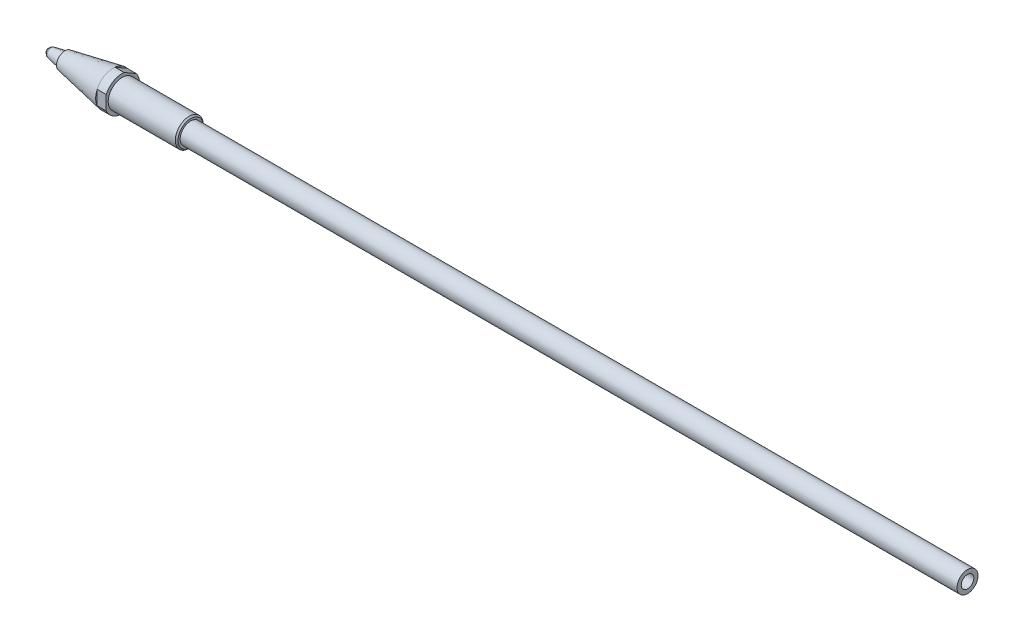
ISO-10303-21;
HEADER;
FILE_DESCRIPTION(('STEP AP214'),'2;1');
FILE_NAME('part.step','',(''),(''),'','','');
FILE_SCHEMA(('AUTOMOTIVE_DESIGN { 1 0 10303 214 1 1 1 1 }'));
ENDSEC;
DATA;
#1=APPLICATION_CONTEXT('core data for automotive mechanical design processes');
#2=APPLICATION_PROTOCOL_DEFINITION('international standard','automotive_design',2000,#1);
#3=PRODUCT_CONTEXT('',#1,'mechanical');
#4=PRODUCT('Part','Part','',(#3));
#5=PRODUCT_RELATED_PRODUCT_CATEGORY('part','',(#4));
#6=PRODUCT_DEFINITION_FORMATION('','',#4);
#7=PRODUCT_DEFINITION_CONTEXT('part definition',#1,'design');
#8=PRODUCT_DEFINITION('design','',#6,#7);
#9=PRODUCT_DEFINITION_SHAPE('','',#8);
#10=(LENGTH_UNIT() NAMED_UNIT(*) SI_UNIT(.MILLI.,.METRE.));
#11=(NAMED_UNIT(*) PLANE_ANGLE_UNIT() SI_UNIT($,.RADIAN.));
#12=(NAMED_UNIT(*) SI_UNIT($,.STERADIAN.) SOLID_ANGLE_UNIT());
#13=UNCERTAINTY_MEASURE_WITH_UNIT(LENGTH_MEASURE(1.E-05),#10,'distance_accuracy_value','');
#14=(GEOMETRIC_REPRESENTATION_CONTEXT(3) GLOBAL_UNCERTAINTY_ASSIGNED_CONTEXT((#13)) GLOBAL_UNIT_ASSIGNED_CONTEXT((#10,
#11,#12)) REPRESENTATION_CONTEXT('',''));
#15=CARTESIAN_POINT('',(0.,0.,0.));
#16=DIRECTION('',(0.,0.,1.));
#17=DIRECTION('',(1.,0.,0.));
#18=AXIS2_PLACEMENT_3D('',#15,#16,#17);
#19=CARTESIAN_POINT('',(60.5,0.,0.));
#20=DIRECTION('',(1.,0.,0.));
#21=DIRECTION('',(0.,0.,-1.));
#22=AXIS2_PLACEMENT_3D('',#19,#20,#21);
#23=PLANE('',#22);
#24=CARTESIAN_POINT('',(60.5,0.,0.));
#25=DIRECTION('',(-1.,0.,0.));
#26=DIRECTION('',(0.,-1.,0.));
#27=AXIS2_PLACEMENT_3D('',#24,#25,#26);
#28=CIRCLE('',#27,0.9);
#29=CARTESIAN_POINT('',(60.5,0.9,0.));
#30=VERTEX_POINT('',#29);
#31=EDGE_CURVE('P0_E27',#30,#30,#28,.T.);
#32=ORIENTED_EDGE('',*,*,#31,.T.);
#33=EDGE_LOOP('',(#32));
#34=FACE_BOUND('',#33,.T.);
#35=CARTESIAN_POINT('',(60.5,0.,0.));
#36=DIRECTION('',(1.,0.,0.));
#37=DIRECTION('',(0.,1.,0.));
#38=AXIS2_PLACEMENT_3D('',#35,#36,#37);
#39=CIRCLE('',#38,1.5);
#40=CARTESIAN_POINT('',(60.5,1.5,0.));
#41=VERTEX_POINT('',#40);
#42=EDGE_CURVE('P0_E11',#41,#41,#39,.T.);
#43=ORIENTED_EDGE('',*,*,#42,.T.);
#44=EDGE_LOOP('',(#43));
#45=FACE_BOUND('',#44,.T.);
#46=ADVANCED_FACE('P0_F17',(#34,#45),#23,.T.);
#47=CARTESIAN_POINT('',(0.,0.,0.));
#48=DIRECTION('',(-1.,0.,0.));
#49=DIRECTION('',(0.,1.,0.));
#50=AXIS2_PLACEMENT_3D('',#47,#48,#49);
#51=CYLINDRICAL_SURFACE('',#50,1.5);
#52=ORIENTED_EDGE('',*,*,#42,.F.);
#53=EDGE_LOOP('',(#52));
#54=FACE_BOUND('',#53,.T.);
#55=CARTESIAN_POINT('',(-60.5,0.,0.));
#56=DIRECTION('',(-1.,0.,0.));
#57=DIRECTION('',(0.,1.,0.));
#58=AXIS2_PLACEMENT_3D('',#55,#56,#57);
#59=CIRCLE('',#58,1.5);
#60=CARTESIAN_POINT('',(-60.5,1.5,0.));
#61=VERTEX_POINT('',#60);
#62=EDGE_CURVE('P0_E42',#61,#61,#59,.T.);
#63=ORIENTED_EDGE('',*,*,#62,.F.);
#64=EDGE_LOOP('',(#63));
#65=FACE_BOUND('',#64,.T.);
#66=ADVANCED_FACE('P0_F19',(#54,#65),#51,.T.);
#67=CARTESIAN_POINT('',(0.,0.,0.));
#68=DIRECTION('',(-1.,0.,0.));
#69=DIRECTION('',(0.,-1.,0.));
#70=AXIS2_PLACEMENT_3D('',#67,#68,#69);
#71=CYLINDRICAL_SURFACE('',#70,0.9);
#72=ORIENTED_EDGE('',*,*,#31,.F.);
#73=EDGE_LOOP('',(#72));
#74=FACE_BOUND('',#73,.T.);
#75=CARTESIAN_POINT('',(-60.5,0.,0.));
#76=DIRECTION('',(1.,0.,0.));
#77=DIRECTION('',(0.,-1.,0.));
#78=AXIS2_PLACEMENT_3D('',#75,#76,#77);
#79=CIRCLE('',#78,0.9);
#80=CARTESIAN_POINT('',(-60.5,0.9,0.));
#81=VERTEX_POINT('',#80);
#82=EDGE_CURVE('P0_E38',#81,#81,#79,.T.);
#83=ORIENTED_EDGE('',*,*,#82,.F.);
#84=EDGE_LOOP('',(#83));
#85=FACE_BOUND('',#84,.T.);
#86=ADVANCED_FACE('P0_F56',(#74,#85),#71,.F.);
#87=CARTESIAN_POINT('',(-60.5,0.,0.));
#88=DIRECTION('',(1.,0.,0.));
#89=DIRECTION('',(0.,0.,-1.));
#90=AXIS2_PLACEMENT_3D('',#87,#88,#89);
#91=PLANE('',#90);
#92=ORIENTED_EDGE('',*,*,#82,.T.);
#93=EDGE_LOOP('',(#92));
#94=FACE_BOUND('',#93,.T.);
#95=ORIENTED_EDGE('',*,*,#62,.T.);
#96=EDGE_LOOP('',(#95));
#97=FACE_BOUND('',#96,.T.);
#98=ADVANCED_FACE('P0_F43',(#94,#97),#91,.F.);
#99=CLOSED_SHELL('',(#46,#66,#86,#98));
#100=MANIFOLD_SOLID_BREP('P0_B1',#99);
#101=CARTESIAN_POINT('',(45.5,0.,0.));
#102=DIRECTION('',(-1.,0.,0.));
#103=DIRECTION('',(0.,0.,1.));
#104=AXIS2_PLACEMENT_3D('',#101,#102,#103);
#105=PLANE('',#104);
#106=CARTESIAN_POINT('',(45.5,0.,0.));
#107=DIRECTION('',(1.,0.,0.));
#108=DIRECTION('',(0.,0.,1.));
#109=AXIS2_PLACEMENT_3D('',#106,#107,#108);
#110=CIRCLE('',#109,0.9);
#111=CARTESIAN_POINT('',(45.5,0.,0.9));
#112=VERTEX_POINT('',#111);
#113=EDGE_CURVE('P1_E20',#112,#112,#110,.T.);
#114=ORIENTED_EDGE('',*,*,#113,.T.);
#115=EDGE_LOOP('',(#114));
#116=FACE_BOUND('',#115,.T.);
#117=ADVANCED_FACE('P1_F17',(#116),#105,.F.);
#118=CARTESIAN_POINT('',(-60.5,0.,0.));
#119=DIRECTION('',(-1.,0.,0.));
#120=DIRECTION('',(0.,0.,1.));
#121=AXIS2_PLACEMENT_3D('',#118,#119,#120);
#122=PLANE('',#121);
#123=CARTESIAN_POINT('',(-60.5,0.,0.));
#124=DIRECTION('',(-1.,0.,0.));
#125=DIRECTION('',(0.,0.,1.));
#126=AXIS2_PLACEMENT_3D('',#123,#124,#125);
#127=CIRCLE('',#126,0.9);
#128=CARTESIAN_POINT('',(-60.5,0.,0.9));
#129=VERTEX_POINT('',#128);
#130=EDGE_CURVE('P1_E11',#129,#129,#127,.T.);
#131=ORIENTED_EDGE('',*,*,#130,.T.);
#132=EDGE_LOOP('',(#131));
#133=FACE_BOUND('',#132,.T.);
#134=ADVANCED_FACE('P1_F45',(#133),#122,.T.);
#135=CARTESIAN_POINT('',(-60.5,0.,0.));
#136=DIRECTION('',(-1.,0.,0.));
#137=DIRECTION('',(0.,0.,1.));
#138=AXIS2_PLACEMENT_3D('',#135,#136,#137);
#139=CYLINDRICAL_SURFACE('',#138,0.9);
#140=ORIENTED_EDGE('',*,*,#130,.F.);
#141=EDGE_LOOP('',(#140));
#142=FACE_BOUND('',#141,.T.);
#143=ORIENTED_EDGE('',*,*,#113,.F.);
#144=EDGE_LOOP('',(#143));
#145=FACE_BOUND('',#144,.T.);
#146=ADVANCED_FACE('P1_F40',(#142,#145),#139,.T.);
#147=CLOSED_SHELL('',(#117,#134,#146));
#148=MANIFOLD_SOLID_BREP('P1_B1',#147);
#149=CARTESIAN_POINT('',(-60.5,0.,-2.));
#150=DIRECTION('',(1.,0.,0.));
#151=DIRECTION('',(0.,0.,-1.));
#152=AXIS2_PLACEMENT_3D('',#149,#150,#151);
#153=PLANE('',#152);
#154=CARTESIAN_POINT('',(-60.5,0.,0.));
#155=DIRECTION('',(1.,0.,0.));
#156=DIRECTION('',(0.,0.,-1.));
#157=AXIS2_PLACEMENT_3D('',#154,#155,#156);
#158=CIRCLE('',#157,2.);
#159=CARTESIAN_POINT('',(-60.5,0.,-2.));
#160=VERTEX_POINT('',#159);
#161=EDGE_CURVE('P2_E82',#160,#160,#158,.T.);
#162=ORIENTED_EDGE('',*,*,#161,.F.);
#163=EDGE_LOOP('',(#162));
#164=FACE_BOUND('',#163,.T.);
#165=DIRECTION('',(0.,0.5,0.866025403784439));
#166=VECTOR('',#165,1.);
#167=CARTESIAN_POINT('',(-60.5,1.28998528875859,-2.3324605483448));
#168=LINE('',#167,#166);
#169=CARTESIAN_POINT('',(-60.5,1.46852197063688,-2.02322594431685));
#170=VERTEX_POINT('',#169);
#171=CARTESIAN_POINT('',(-60.5,2.48642605069259,-0.2601643604287));
#172=VERTEX_POINT('',#171);
#173=EDGE_CURVE('P2_E112',#170,#172,#168,.T.);
#174=ORIENTED_EDGE('',*,*,#173,.T.);
#175=CARTESIAN_POINT('',(-60.5,0.,0.));
#176=DIRECTION('',(1.,0.,0.));
#177=DIRECTION('',(0.,0.,-1.));
#178=AXIS2_PLACEMENT_3D('',#175,#176,#177);
#179=CIRCLE('',#178,2.5);
#180=CARTESIAN_POINT('',(-60.5,1.01790408005571,2.28339030474555));
#181=VERTEX_POINT('',#180);
#182=EDGE_CURVE('P2_E78',#172,#181,#179,.T.);
#183=ORIENTED_EDGE('',*,*,#182,.T.);
#184=DIRECTION('',(0.,-1.,0.));
#185=VECTOR('',#184,1.);
#186=CARTESIAN_POINT('',(-60.5,0.508952040027854,2.28339030474555));
#187=LINE('',#186,#185);
#188=CARTESIAN_POINT('',(-60.5,-1.01790408005571,2.28339030474555));
#189=VERTEX_POINT('',#188);
#190=EDGE_CURVE('P2_E70',#181,#189,#187,.T.);
#191=ORIENTED_EDGE('',*,*,#190,.T.);
#192=CARTESIAN_POINT('',(-60.5,0.,0.));
#193=DIRECTION('',(1.,0.,0.));
#194=DIRECTION('',(0.,0.,-1.));
#195=AXIS2_PLACEMENT_3D('',#192,#193,#194);
#196=CIRCLE('',#195,2.5);
#197=CARTESIAN_POINT('',(-60.5,-2.48642605069259,-0.260164360428699));
#198=VERTEX_POINT('',#197);
#199=EDGE_CURVE('P2_E75',#189,#198,#196,.T.);
#200=ORIENTED_EDGE('',*,*,#199,.T.);
#201=DIRECTION('',(0.,0.5,-0.866025403784439));
#202=VECTOR('',#201,1.);
#203=CARTESIAN_POINT('',(-60.5,-1.79893732878644,-1.45092975640073));
#204=LINE('',#203,#202);
#205=CARTESIAN_POINT('',(-60.5,-1.46852197063688,-2.02322594431685));
#206=VERTEX_POINT('',#205);
#207=EDGE_CURVE('P2_E179',#198,#206,#204,.T.);
#208=ORIENTED_EDGE('',*,*,#207,.T.);
#209=CARTESIAN_POINT('',(-60.5,0.,0.));
#210=DIRECTION('',(1.,0.,0.));
#211=DIRECTION('',(0.,0.,-1.));
#212=AXIS2_PLACEMENT_3D('',#209,#210,#211);
#213=CIRCLE('',#212,2.5);
#214=EDGE_CURVE('P2_E64',#206,#170,#213,.T.);
#215=ORIENTED_EDGE('',*,*,#214,.T.);
#216=EDGE_LOOP('',(#174,#183,#191,#200,#208,#215));
#217=FACE_BOUND('',#216,.T.);
#218=ADVANCED_FACE('P2_F17',(#164,#217),#153,.T.);
#219=CARTESIAN_POINT('',(-65.25,0.,0.));
#220=DIRECTION('',(1.,0.,0.));
#221=DIRECTION('',(0.,0.,-1.));
#222=AXIS2_PLACEMENT_3D('',#219,#220,#221);
#223=CONICAL_SURFACE('',#222,1.85,0.186222840411141);
#224=CARTESIAN_POINT('',(-61.8,0.,0.));
#225=DIRECTION('',(1.,0.,0.));
#226=DIRECTION('',(0.,0.,-1.));
#227=AXIS2_PLACEMENT_3D('',#224,#225,#226);
#228=CIRCLE('',#227,2.5);
#229=CARTESIAN_POINT('',(-61.8,-1.01790408005571,2.28339030474555));
#230=VERTEX_POINT('',#229);
#231=CARTESIAN_POINT('',(-61.8,-2.48642605069259,-0.260164360428699));
#232=VERTEX_POINT('',#231);
#233=EDGE_CURVE('P2_E91',#230,#232,#228,.T.);
#234=ORIENTED_EDGE('',*,*,#233,.F.);
#235=CARTESIAN_POINT('',(-61.8,0.,0.));
#236=DIRECTION('',(1.,0.,0.));
#237=DIRECTION('',(0.,0.,-1.));
#238=AXIS2_PLACEMENT_3D('',#235,#236,#237);
#239=CIRCLE('',#238,2.5);
#240=CARTESIAN_POINT('',(-61.8,1.01790408005571,2.28339030474555));
#241=VERTEX_POINT('',#240);
#242=EDGE_CURVE('P2_E118',#241,#230,#239,.T.);
#243=ORIENTED_EDGE('',*,*,#242,.F.);
#244=CARTESIAN_POINT('',(-61.8,0.,0.));
#245=DIRECTION('',(1.,0.,0.));
#246=DIRECTION('',(0.,0.,-1.));
#247=AXIS2_PLACEMENT_3D('',#244,#245,#246);
#248=CIRCLE('',#247,2.5);
#249=CARTESIAN_POINT('',(-61.8,2.48642605069259,-0.2601643604287));
#250=VERTEX_POINT('',#249);
#251=EDGE_CURVE('P2_E106',#250,#241,#248,.T.);
#252=ORIENTED_EDGE('',*,*,#251,.F.);
#253=CARTESIAN_POINT('',(-61.8,0.,0.));
#254=DIRECTION('',(1.,0.,0.));
#255=DIRECTION('',(0.,0.,-1.));
#256=AXIS2_PLACEMENT_3D('',#253,#254,#255);
#257=CIRCLE('',#256,2.5);
#258=CARTESIAN_POINT('',(-61.8,1.46852197063688,-2.02322594431685));
#259=VERTEX_POINT('',#258);
#260=EDGE_CURVE('P2_E113',#259,#250,#257,.T.);
#261=ORIENTED_EDGE('',*,*,#260,.F.);
#262=CARTESIAN_POINT('',(-61.8,0.,0.));
#263=DIRECTION('',(1.,0.,0.));
#264=DIRECTION('',(0.,0.,-1.));
#265=AXIS2_PLACEMENT_3D('',#262,#263,#264);
#266=CIRCLE('',#265,2.5);
#267=CARTESIAN_POINT('',(-61.8,-1.46852197063688,-2.02322594431685));
#268=VERTEX_POINT('',#267);
#269=EDGE_CURVE('P2_E124',#268,#259,#266,.T.);
#270=ORIENTED_EDGE('',*,*,#269,.F.);
#271=CARTESIAN_POINT('',(-61.8,0.,0.));
#272=DIRECTION('',(1.,0.,0.));
#273=DIRECTION('',(0.,0.,-1.));
#274=AXIS2_PLACEMENT_3D('',#271,#272,#273);
#275=CIRCLE('',#274,2.5);
#276=EDGE_CURVE('P2_E140',#232,#268,#275,.T.);
#277=ORIENTED_EDGE('',*,*,#276,.F.);
#278=EDGE_LOOP('',(#234,#243,#252,#261,#270,#277));
#279=FACE_BOUND('',#278,.T.);
#280=CARTESIAN_POINT('',(-68.7,0.,0.));
#281=DIRECTION('',(1.,0.,0.));
#282=DIRECTION('',(0.,0.,-1.));
#283=AXIS2_PLACEMENT_3D('',#280,#281,#282);
#284=CIRCLE('',#283,1.2);
#285=CARTESIAN_POINT('',(-68.7,0.,-1.2));
#286=VERTEX_POINT('',#285);
#287=EDGE_CURVE('P2_E11',#286,#286,#284,.T.);
#288=ORIENTED_EDGE('',*,*,#287,.T.);
#289=EDGE_LOOP('',(#288));
#290=FACE_BOUND('',#289,.T.);
#291=ADVANCED_FACE('P2_F207',(#279,#290),#223,.T.);
#292=CARTESIAN_POINT('',(-68.7,0.,-1.2));
#293=DIRECTION('',(-1.,0.,0.));
#294=DIRECTION('',(0.,0.,1.));
#295=AXIS2_PLACEMENT_3D('',#292,#293,#294);
#296=PLANE('',#295);
#297=ORIENTED_EDGE('',*,*,#287,.F.);
#298=EDGE_LOOP('',(#297));
#299=FACE_BOUND('',#298,.T.);
#300=CARTESIAN_POINT('',(-68.7,0.,0.));
#301=DIRECTION('',(1.,0.,0.));
#302=DIRECTION('',(0.,0.,-1.));
#303=AXIS2_PLACEMENT_3D('',#300,#301,#302);
#304=CIRCLE('',#303,1.);
#305=CARTESIAN_POINT('',(-68.7,0.,-1.));
#306=VERTEX_POINT('',#305);
#307=EDGE_CURVE('P2_E28',#306,#306,#304,.T.);
#308=ORIENTED_EDGE('',*,*,#307,.T.);
#309=EDGE_LOOP('',(#308));
#310=FACE_BOUND('',#309,.T.);
#311=ADVANCED_FACE('P2_F232',(#299,#310),#296,.T.);
#312=CARTESIAN_POINT('',(-67.786064992748,0.,0.));
#313=DIRECTION('',(-1.,0.,0.));
#314=DIRECTION('',(0.,0.,-1.));
#315=AXIS2_PLACEMENT_3D('',#312,#313,#314);
#316=CYLINDRICAL_SURFACE('',#315,1.);
#317=ORIENTED_EDGE('',*,*,#307,.F.);
#318=EDGE_LOOP('',(#317));
#319=FACE_BOUND('',#318,.T.);
#320=CARTESIAN_POINT('',(-66.8721299854961,0.,0.));
#321=DIRECTION('',(1.,0.,0.));
#322=DIRECTION('',(0.,0.,-1.));
#323=AXIS2_PLACEMENT_3D('',#320,#321,#322);
#324=CIRCLE('',#323,1.);
#325=CARTESIAN_POINT('',(-66.8721299854961,0.,-1.));
#326=VERTEX_POINT('',#325);
#327=EDGE_CURVE('P2_E145',#326,#326,#324,.T.);
#328=ORIENTED_EDGE('',*,*,#327,.T.);
#329=EDGE_LOOP('',(#328));
#330=FACE_BOUND('',#329,.T.);
#331=ADVANCED_FACE('P2_F261',(#319,#330),#316,.F.);
#332=CARTESIAN_POINT('',(-64.336064992748,0.,0.));
#333=DIRECTION('',(1.,0.,0.));
#334=DIRECTION('',(0.,0.,-1.));
#335=AXIS2_PLACEMENT_3D('',#332,#333,#334);
#336=CONICAL_SURFACE('',#335,1.47780934645977,0.186222840411142);
#337=ORIENTED_EDGE('',*,*,#327,.F.);
#338=EDGE_LOOP('',(#337));
#339=FACE_BOUND('',#338,.T.);
#340=CARTESIAN_POINT('',(-61.8,0.,0.));
#341=DIRECTION('',(1.,0.,0.));
#342=DIRECTION('',(0.,0.,-1.));
#343=AXIS2_PLACEMENT_3D('',#340,#341,#342);
#344=CIRCLE('',#343,1.95561869291954);
#345=CARTESIAN_POINT('',(-61.8,0.,-1.95561869291954));
#346=VERTEX_POINT('',#345);
#347=EDGE_CURVE('P2_E149',#346,#346,#344,.T.);
#348=ORIENTED_EDGE('',*,*,#347,.T.);
#349=EDGE_LOOP('',(#348));
#350=FACE_BOUND('',#349,.T.);
#351=ADVANCED_FACE('P2_F242',(#339,#350),#336,.F.);
#352=CARTESIAN_POINT('',(-61.8,0.,-1.95561869291954));
#353=DIRECTION('',(-1.,0.,0.));
#354=DIRECTION('',(0.,0.,1.));
#355=AXIS2_PLACEMENT_3D('',#352,#353,#354);
#356=PLANE('',#355);
#357=ORIENTED_EDGE('',*,*,#347,.F.);
#358=EDGE_LOOP('',(#357));
#359=FACE_BOUND('',#358,.T.);
#360=CARTESIAN_POINT('',(-61.8,0.,0.));
#361=DIRECTION('',(1.,0.,0.));
#362=DIRECTION('',(0.,0.,-1.));
#363=AXIS2_PLACEMENT_3D('',#360,#361,#362);
#364=CIRCLE('',#363,1.5);
#365=CARTESIAN_POINT('',(-61.8,0.,-1.5));
#366=VERTEX_POINT('',#365);
#367=EDGE_CURVE('P2_E152',#366,#366,#364,.T.);
#368=ORIENTED_EDGE('',*,*,#367,.T.);
#369=EDGE_LOOP('',(#368));
#370=FACE_BOUND('',#369,.T.);
#371=ADVANCED_FACE('P2_F239',(#359,#370),#356,.T.);
#372=CARTESIAN_POINT('',(-56.25,0.,0.));
#373=DIRECTION('',(-1.,0.,0.));
#374=DIRECTION('',(0.,0.,-1.));
#375=AXIS2_PLACEMENT_3D('',#372,#373,#374);
#376=CYLINDRICAL_SURFACE('',#375,1.5);
#377=ORIENTED_EDGE('',*,*,#367,.F.);
#378=EDGE_LOOP('',(#377));
#379=FACE_BOUND('',#378,.T.);
#380=CARTESIAN_POINT('',(-50.7,0.,0.));
#381=DIRECTION('',(1.,0.,0.));
#382=DIRECTION('',(0.,0.,-1.));
#383=AXIS2_PLACEMENT_3D('',#380,#381,#382);
#384=CIRCLE('',#383,1.5);
#385=CARTESIAN_POINT('',(-50.7,0.,-1.5));
#386=VERTEX_POINT('',#385);
#387=EDGE_CURVE('P2_E155',#386,#386,#384,.T.);
#388=ORIENTED_EDGE('',*,*,#387,.T.);
#389=EDGE_LOOP('',(#388));
#390=FACE_BOUND('',#389,.T.);
#391=ADVANCED_FACE('P2_F241',(#379,#390),#376,.F.);
#392=CARTESIAN_POINT('',(-50.7,0.,-1.5));
#393=DIRECTION('',(1.,0.,0.));
#394=DIRECTION('',(0.,0.,-1.));
#395=AXIS2_PLACEMENT_3D('',#392,#393,#394);
#396=PLANE('',#395);
#397=ORIENTED_EDGE('',*,*,#387,.F.);
#398=EDGE_LOOP('',(#397));
#399=FACE_BOUND('',#398,.T.);
#400=CARTESIAN_POINT('',(-50.7,0.,0.));
#401=DIRECTION('',(1.,0.,0.));
#402=DIRECTION('',(0.,0.,-1.));
#403=AXIS2_PLACEMENT_3D('',#400,#401,#402);
#404=CIRCLE('',#403,1.8);
#405=CARTESIAN_POINT('',(-50.7,0.,-1.8));
#406=VERTEX_POINT('',#405);
#407=EDGE_CURVE('P2_E156',#406,#406,#404,.T.);
#408=ORIENTED_EDGE('',*,*,#407,.T.);
#409=EDGE_LOOP('',(#408));
#410=FACE_BOUND('',#409,.T.);
#411=ADVANCED_FACE('P2_F237',(#399,#410),#396,.T.);
#412=CARTESIAN_POINT('',(-50.8,0.,0.));
#413=DIRECTION('',(-1.,0.,0.));
#414=DIRECTION('',(0.,0.,-1.));
#415=AXIS2_PLACEMENT_3D('',#412,#413,#414);
#416=CONICAL_SURFACE('',#415,1.9,0.785398163397459);
#417=ORIENTED_EDGE('',*,*,#407,.F.);
#418=EDGE_LOOP('',(#417));
#419=FACE_BOUND('',#418,.T.);
#420=CARTESIAN_POINT('',(-50.9,0.,0.));
#421=DIRECTION('',(1.,0.,0.));
#422=DIRECTION('',(0.,0.,-1.));
#423=AXIS2_PLACEMENT_3D('',#420,#421,#422);
#424=CIRCLE('',#423,2.);
#425=CARTESIAN_POINT('',(-50.9,0.,-2.));
#426=VERTEX_POINT('',#425);
#427=EDGE_CURVE('P2_E116',#426,#426,#424,.T.);
#428=ORIENTED_EDGE('',*,*,#427,.T.);
#429=EDGE_LOOP('',(#428));
#430=FACE_BOUND('',#429,.T.);
#431=ADVANCED_FACE('P2_F255',(#419,#430),#416,.T.);
#432=CARTESIAN_POINT('',(-55.7,0.,0.));
#433=DIRECTION('',(-1.,0.,0.));
#434=DIRECTION('',(0.,0.,-1.));
#435=AXIS2_PLACEMENT_3D('',#432,#433,#434);
#436=CYLINDRICAL_SURFACE('',#435,2.);
#437=ORIENTED_EDGE('',*,*,#427,.F.);
#438=EDGE_LOOP('',(#437));
#439=FACE_BOUND('',#438,.T.);
#440=ORIENTED_EDGE('',*,*,#161,.T.);
#441=EDGE_LOOP('',(#440));
#442=FACE_BOUND('',#441,.T.);
#443=ADVANCED_FACE('P2_F250',(#439,#442),#436,.T.);
#444=CARTESIAN_POINT('',(-60.5,1.01790408005571,2.28339030474555));
#445=DIRECTION('',(0.,0.,-1.));
#446=DIRECTION('',(0.,-1.,0.));
#447=AXIS2_PLACEMENT_3D('',#444,#445,#446);
#448=PLANE('',#447);
#449=ORIENTED_EDGE('',*,*,#190,.F.);
#450=DIRECTION('',(1.,0.,0.));
#451=VECTOR('',#450,1.);
#452=CARTESIAN_POINT('',(-61.15,1.01790408005571,2.28339030474555));
#453=LINE('',#452,#451);
#454=EDGE_CURVE('P2_E21',#241,#181,#453,.T.);
#455=ORIENTED_EDGE('',*,*,#454,.F.);
#456=DIRECTION('',(0.,-1.,0.));
#457=VECTOR('',#456,1.);
#458=CARTESIAN_POINT('',(-61.8,-1.01790408005571,2.28339030474555));
#459=LINE('',#458,#457);
#460=EDGE_CURVE('P2_E83',#241,#230,#459,.T.);
#461=ORIENTED_EDGE('',*,*,#460,.T.);
#462=DIRECTION('',(-1.,0.,0.));
#463=VECTOR('',#462,1.);
#464=CARTESIAN_POINT('',(-61.15,-1.01790408005571,2.28339030474555));
#465=LINE('',#464,#463);
#466=EDGE_CURVE('P2_E86',#189,#230,#465,.T.);
#467=ORIENTED_EDGE('',*,*,#466,.F.);
#468=EDGE_LOOP('',(#449,#455,#461,#467));
#469=FACE_BOUND('',#468,.T.);
#470=ADVANCED_FACE('P2_F87',(#469),#448,.F.);
#471=CARTESIAN_POINT('',(-61.8,0.,2.47322424151381));
#472=DIRECTION('',(-1.,0.,0.));
#473=DIRECTION('',(0.,0.,1.));
#474=AXIS2_PLACEMENT_3D('',#471,#472,#473);
#475=PLANE('',#474);
#476=ORIENTED_EDGE('',*,*,#242,.T.);
#477=ORIENTED_EDGE('',*,*,#460,.F.);
#478=EDGE_LOOP('',(#476,#477));
#479=FACE_BOUND('',#478,.T.);
#480=ADVANCED_FACE('P2_F249',(#479),#475,.F.);
#481=CARTESIAN_POINT('',(-61.15,0.,0.));
#482=DIRECTION('',(-1.,0.,0.));
#483=DIRECTION('',(0.,0.,-1.));
#484=AXIS2_PLACEMENT_3D('',#481,#482,#483);
#485=CYLINDRICAL_SURFACE('',#484,2.5);
#486=DIRECTION('',(-1.,0.,0.));
#487=VECTOR('',#486,1.);
#488=CARTESIAN_POINT('',(-61.15,2.48642605069259,-0.2601643604287));
#489=LINE('',#488,#487);
#490=EDGE_CURVE('P2_E144',#172,#250,#489,.T.);
#491=ORIENTED_EDGE('',*,*,#490,.T.);
#492=ORIENTED_EDGE('',*,*,#251,.T.);
#493=ORIENTED_EDGE('',*,*,#454,.T.);
#494=ORIENTED_EDGE('',*,*,#182,.F.);
#495=EDGE_LOOP('',(#491,#492,#493,#494));
#496=FACE_BOUND('',#495,.T.);
#497=ADVANCED_FACE('P2_F253',(#496),#485,.T.);
#498=CARTESIAN_POINT('',(-61.15,0.,0.));
#499=DIRECTION('',(-1.,0.,0.));
#500=DIRECTION('',(0.,0.,-1.));
#501=AXIS2_PLACEMENT_3D('',#498,#499,#500);
#502=CYLINDRICAL_SURFACE('',#501,2.5);
#503=DIRECTION('',(1.,0.,0.));
#504=VECTOR('',#503,1.);
#505=CARTESIAN_POINT('',(-61.15,1.46852197063688,-2.02322594431685));
#506=LINE('',#505,#504);
#507=EDGE_CURVE('P2_E177',#259,#170,#506,.T.);
#508=ORIENTED_EDGE('',*,*,#507,.T.);
#509=ORIENTED_EDGE('',*,*,#214,.F.);
#510=DIRECTION('',(-1.,0.,0.));
#511=VECTOR('',#510,1.);
#512=CARTESIAN_POINT('',(-61.15,-1.46852197063688,-2.02322594431685));
#513=LINE('',#512,#511);
#514=EDGE_CURVE('P2_E98',#206,#268,#513,.T.);
#515=ORIENTED_EDGE('',*,*,#514,.T.);
#516=ORIENTED_EDGE('',*,*,#269,.T.);
#517=EDGE_LOOP('',(#508,#509,#515,#516));
#518=FACE_BOUND('',#517,.T.);
#519=ADVANCED_FACE('P2_F19',(#518),#502,.T.);
#520=CARTESIAN_POINT('',(-61.15,0.,0.));
#521=DIRECTION('',(-1.,0.,0.));
#522=DIRECTION('',(0.,0.,-1.));
#523=AXIS2_PLACEMENT_3D('',#520,#521,#522);
#524=CYLINDRICAL_SURFACE('',#523,2.5);
#525=DIRECTION('',(1.,0.,0.));
#526=VECTOR('',#525,1.);
#527=CARTESIAN_POINT('',(-61.15,-2.48642605069259,-0.260164360428699));
#528=LINE('',#527,#526);
#529=EDGE_CURVE('P2_E95',#232,#198,#528,.T.);
#530=ORIENTED_EDGE('',*,*,#529,.T.);
#531=ORIENTED_EDGE('',*,*,#199,.F.);
#532=ORIENTED_EDGE('',*,*,#466,.T.);
#533=ORIENTED_EDGE('',*,*,#233,.T.);
#534=EDGE_LOOP('',(#530,#531,#532,#533));
#535=FACE_BOUND('',#534,.T.);
#536=ADVANCED_FACE('P2_F93',(#535),#524,.T.);
#537=CARTESIAN_POINT('',(-60.5,-2.48642605069259,-0.260164360428699));
#538=DIRECTION('',(0.,0.866025403784439,0.5));
#539=DIRECTION('',(0.,0.5,-0.866025403784439));
#540=AXIS2_PLACEMENT_3D('',#537,#538,#539);
#541=PLANE('',#540);
#542=ORIENTED_EDGE('',*,*,#207,.F.);
#543=ORIENTED_EDGE('',*,*,#529,.F.);
#544=DIRECTION('',(0.,0.5,-0.866025403784439));
#545=VECTOR('',#544,1.);
#546=CARTESIAN_POINT('',(-61.8,-1.46852197063688,-2.02322594431685));
#547=LINE('',#546,#545);
#548=EDGE_CURVE('P2_E143',#232,#268,#547,.T.);
#549=ORIENTED_EDGE('',*,*,#548,.T.);
#550=ORIENTED_EDGE('',*,*,#514,.F.);
#551=EDGE_LOOP('',(#542,#543,#549,#550));
#552=FACE_BOUND('',#551,.T.);
#553=ADVANCED_FACE('P2_F212',(#552),#541,.F.);
#554=CARTESIAN_POINT('',(-61.8,-2.14187502240646,-1.2366121207569));
#555=DIRECTION('',(-1.,0.,0.));
#556=DIRECTION('',(0.,-0.866025403784439,-0.5));
#557=AXIS2_PLACEMENT_3D('',#554,#555,#556);
#558=PLANE('',#557);
#559=ORIENTED_EDGE('',*,*,#276,.T.);
#560=ORIENTED_EDGE('',*,*,#548,.F.);
#561=EDGE_LOOP('',(#559,#560));
#562=FACE_BOUND('',#561,.T.);
#563=ADVANCED_FACE('P2_F214',(#562),#558,.F.);
#564=CARTESIAN_POINT('',(-60.5,1.46852197063688,-2.02322594431685));
#565=DIRECTION('',(0.,-0.866025403784438,0.5));
#566=DIRECTION('',(0.,0.5,0.866025403784438));
#567=AXIS2_PLACEMENT_3D('',#564,#565,#566);
#568=PLANE('',#567);
#569=ORIENTED_EDGE('',*,*,#173,.F.);
#570=ORIENTED_EDGE('',*,*,#507,.F.);
#571=DIRECTION('',(0.,0.5,0.866025403784439));
#572=VECTOR('',#571,1.);
#573=CARTESIAN_POINT('',(-61.8,2.48642605069259,-0.2601643604287));
#574=LINE('',#573,#572);
#575=EDGE_CURVE('P2_E109',#259,#250,#574,.T.);
#576=ORIENTED_EDGE('',*,*,#575,.T.);
#577=ORIENTED_EDGE('',*,*,#490,.F.);
#578=EDGE_LOOP('',(#569,#570,#576,#577));
#579=FACE_BOUND('',#578,.T.);
#580=ADVANCED_FACE('P2_F187',(#579),#568,.F.);
#581=CARTESIAN_POINT('',(-61.8,2.14187502240645,-1.2366121207569));
#582=DIRECTION('',(-1.,0.,0.));
#583=DIRECTION('',(0.,0.866025403784438,-0.5));
#584=AXIS2_PLACEMENT_3D('',#581,#582,#583);
#585=PLANE('',#584);
#586=ORIENTED_EDGE('',*,*,#260,.T.);
#587=ORIENTED_EDGE('',*,*,#575,.F.);
#588=EDGE_LOOP('',(#586,#587));
#589=FACE_BOUND('',#588,.T.);
#590=ADVANCED_FACE('P2_F222',(#589),#585,.F.);
#591=CLOSED_SHELL('',(#218,#291,#311,#331,#351,#371,#391,#411,#431,#443,#470,#480,#497,#519,
#536,#553,#563,#580,#590));
#592=MANIFOLD_SOLID_BREP('P2_B1',#591);
#593=CARTESIAN_POINT('',(-69.45,0.,0.));
#594=DIRECTION('',(1.,0.,0.));
#595=DIRECTION('',(0.,0.,-1.));
#596=AXIS2_PLACEMENT_3D('',#593,#594,#595);
#597=CONICAL_SURFACE('',#596,0.436887853066543,0.214148108443051);
#598=CARTESIAN_POINT('',(-70.2,0.,0.));
#599=DIRECTION('',(1.,0.,0.));
#600=DIRECTION('',(0.,0.,-1.));
#601=AXIS2_PLACEMENT_3D('',#598,#599,#600);
#602=CIRCLE('',#601,0.273775706133088);
#603=CARTESIAN_POINT('',(-70.2,0.,-0.273775706133088));
#604=VERTEX_POINT('',#603);
#605=EDGE_CURVE('P3_E57',#604,#604,#602,.T.);
#606=ORIENTED_EDGE('',*,*,#605,.F.);
#607=EDGE_LOOP('',(#606));
#608=FACE_BOUND('',#607,.T.);
#609=CARTESIAN_POINT('',(-68.7,0.,0.));
#610=DIRECTION('',(1.,0.,0.));
#611=DIRECTION('',(0.,0.,-1.));
#612=AXIS2_PLACEMENT_3D('',#609,#610,#611);
#613=CIRCLE('',#612,0.6);
#614=CARTESIAN_POINT('',(-68.7,0.,-0.6));
#615=VERTEX_POINT('',#614);
#616=EDGE_CURVE('P3_E11',#615,#615,#613,.T.);
#617=ORIENTED_EDGE('',*,*,#616,.T.);
#618=EDGE_LOOP('',(#617));
#619=FACE_BOUND('',#618,.T.);
#620=ADVANCED_FACE('P3_F17',(#608,#619),#597,.F.);
#621=CARTESIAN_POINT('',(-67.786064992748,0.,0.));
#622=DIRECTION('',(-1.,0.,0.));
#623=DIRECTION('',(0.,0.,-1.));
#624=AXIS2_PLACEMENT_3D('',#621,#622,#623);
#625=CYLINDRICAL_SURFACE('',#624,0.6);
#626=ORIENTED_EDGE('',*,*,#616,.F.);
#627=EDGE_LOOP('',(#626));
#628=FACE_BOUND('',#627,.T.);
#629=CARTESIAN_POINT('',(-66.8721299854961,0.,0.));
#630=DIRECTION('',(1.,0.,0.));
#631=DIRECTION('',(0.,0.,-1.));
#632=AXIS2_PLACEMENT_3D('',#629,#630,#631);
#633=CIRCLE('',#632,0.6);
#634=CARTESIAN_POINT('',(-66.8721299854961,0.,-0.6));
#635=VERTEX_POINT('',#634);
#636=EDGE_CURVE('P3_E28',#635,#635,#633,.T.);
#637=ORIENTED_EDGE('',*,*,#636,.T.);
#638=EDGE_LOOP('',(#637));
#639=FACE_BOUND('',#638,.T.);
#640=ADVANCED_FACE('P3_F91',(#628,#639),#625,.F.);
#641=CARTESIAN_POINT('',(-66.8721299854961,0.,-0.6));
#642=DIRECTION('',(1.,0.,0.));
#643=DIRECTION('',(0.,0.,-1.));
#644=AXIS2_PLACEMENT_3D('',#641,#642,#643);
#645=PLANE('',#644);
#646=ORIENTED_EDGE('',*,*,#636,.F.);
#647=EDGE_LOOP('',(#646));
#648=FACE_BOUND('',#647,.T.);
#649=CARTESIAN_POINT('',(-66.8721299854961,0.,0.));
#650=DIRECTION('',(1.,0.,0.));
#651=DIRECTION('',(0.,0.,-1.));
#652=AXIS2_PLACEMENT_3D('',#649,#650,#651);
#653=CIRCLE('',#652,1.);
#654=CARTESIAN_POINT('',(-66.8721299854961,0.,-1.));
#655=VERTEX_POINT('',#654);
#656=EDGE_CURVE('P3_E59',#655,#655,#653,.T.);
#657=ORIENTED_EDGE('',*,*,#656,.T.);
#658=EDGE_LOOP('',(#657));
#659=FACE_BOUND('',#658,.T.);
#660=ADVANCED_FACE('P3_F96',(#648,#659),#645,.T.);
#661=CARTESIAN_POINT('',(-67.786064992748,0.,0.));
#662=DIRECTION('',(-1.,0.,0.));
#663=DIRECTION('',(0.,0.,-1.));
#664=AXIS2_PLACEMENT_3D('',#661,#662,#663);
#665=CYLINDRICAL_SURFACE('',#664,1.);
#666=ORIENTED_EDGE('',*,*,#656,.F.);
#667=EDGE_LOOP('',(#666));
#668=FACE_BOUND('',#667,.T.);
#669=CARTESIAN_POINT('',(-68.7,0.,0.));
#670=DIRECTION('',(1.,0.,0.));
#671=DIRECTION('',(0.,0.,-1.));
#672=AXIS2_PLACEMENT_3D('',#669,#670,#671);
#673=CIRCLE('',#672,1.);
#674=CARTESIAN_POINT('',(-68.7,0.,-1.));
#675=VERTEX_POINT('',#674);
#676=EDGE_CURVE('P3_E55',#675,#675,#673,.T.);
#677=ORIENTED_EDGE('',*,*,#676,.T.);
#678=EDGE_LOOP('',(#677));
#679=FACE_BOUND('',#678,.T.);
#680=ADVANCED_FACE('P3_F76',(#668,#679),#665,.T.);
#681=CARTESIAN_POINT('',(-70.6666192807241,0.,0.));
#682=DIRECTION('',(1.,0.,0.));
#683=DIRECTION('',(0.,0.,1.));
#684=AXIS2_PLACEMENT_3D('',#681,#682,#683);
#685=DEGENERATE_TOROIDAL_SURFACE('',#684,0.0764848364170093,0.583451798189823,.F.);
#686=CARTESIAN_POINT('',(-70.9,0.,0.));
#687=DIRECTION('',(1.,0.,0.));
#688=DIRECTION('',(0.,0.,-1.));
#689=AXIS2_PLACEMENT_3D('',#686,#687,#688);
#690=CIRCLE('',#689,0.45825756949559);
#691=CARTESIAN_POINT('',(-70.9,0.,0.458257569495588));
#692=VERTEX_POINT('',#691);
#693=EDGE_CURVE('P3_E52',#692,#692,#690,.T.);
#694=ORIENTED_EDGE('',*,*,#693,.F.);
#695=EDGE_LOOP('',(#694));
#696=FACE_BOUND('',#695,.T.);
#697=ORIENTED_EDGE('',*,*,#605,.T.);
#698=EDGE_LOOP('',(#697));
#699=FACE_BOUND('',#698,.T.);
#700=ADVANCED_FACE('P3_F80',(#696,#699),#685,.T.);
#701=CARTESIAN_POINT('',(-69.8,0.,0.));
#702=DIRECTION('',(1.,0.,0.));
#703=DIRECTION('',(0.,0.,-1.));
#704=AXIS2_PLACEMENT_3D('',#701,#702,#703);
#705=CONICAL_SURFACE('',#704,0.792753623188406,0.18622284041114);
#706=CARTESIAN_POINT('',(-70.6376549610575,0.,0.));
#707=DIRECTION('',(-1.,0.,0.));
#708=DIRECTION('',(0.,0.,-1.));
#709=AXIS2_PLACEMENT_3D('',#706,#707,#708);
#710=CIRCLE('',#709,0.634934572554388);
#711=CARTESIAN_POINT('',(-70.6376549610575,0.,0.634934572554388));
#712=VERTEX_POINT('',#711);
#713=EDGE_CURVE('P3_E21',#712,#712,#710,.T.);
#714=ORIENTED_EDGE('',*,*,#713,.F.);
#715=EDGE_LOOP('',(#714));
#716=FACE_BOUND('',#715,.T.);
#717=ORIENTED_EDGE('',*,*,#676,.F.);
#718=EDGE_LOOP('',(#717));
#719=FACE_BOUND('',#718,.T.);
#720=ADVANCED_FACE('P3_F78',(#716,#719),#705,.T.);
#721=CARTESIAN_POINT('',(-70.563595613111,0.,0.));
#722=DIRECTION('',(1.,0.,0.));
#723=DIRECTION('',(0.,0.,-1.));
#724=AXIS2_PLACEMENT_3D('',#721,#722,#723);
#725=DEGENERATE_TOROIDAL_SURFACE('',#724,0.241850341146227,0.4,.T.);
#726=ORIENTED_EDGE('',*,*,#713,.T.);
#727=EDGE_LOOP('',(#726));
#728=FACE_BOUND('',#727,.T.);
#729=ORIENTED_EDGE('',*,*,#693,.T.);
#730=EDGE_LOOP('',(#729));
#731=FACE_BOUND('',#730,.T.);
#732=ADVANCED_FACE('P3_F19',(#728,#731),#725,.T.);
#733=CLOSED_SHELL('',(#620,#640,#660,#680,#700,#720,#732));
#734=MANIFOLD_SOLID_BREP('P3_B1',#733);
#735=CARTESIAN_POINT('',(-70.7,0.,0.));
#736=DIRECTION('',(1.,0.,0.));
#737=DIRECTION('',(0.,-1.,0.));
#738=AXIS2_PLACEMENT_3D('',#735,#736,#737);
#739=SPHERICAL_SURFACE('',#738,0.5);
#740=CARTESIAN_POINT('',(-70.2,0.,0.));
#741=VERTEX_POINT('',#740);
#742=VERTEX_LOOP('',#741);
#743=FACE_BOUND('',#742,.T.);
#744=ADVANCED_FACE('P4_F12',(#743),#739,.T.);
#745=CLOSED_SHELL('',(#744));
#746=MANIFOLD_SOLID_BREP('P4_B1',#745);
#747=ADVANCED_BREP_SHAPE_REPRESENTATION('',(#18,#100,#148,#592,#734,#746),#14);
#748=SHAPE_DEFINITION_REPRESENTATION(#9,#747);
ENDSEC;
END-ISO-10303-21;
